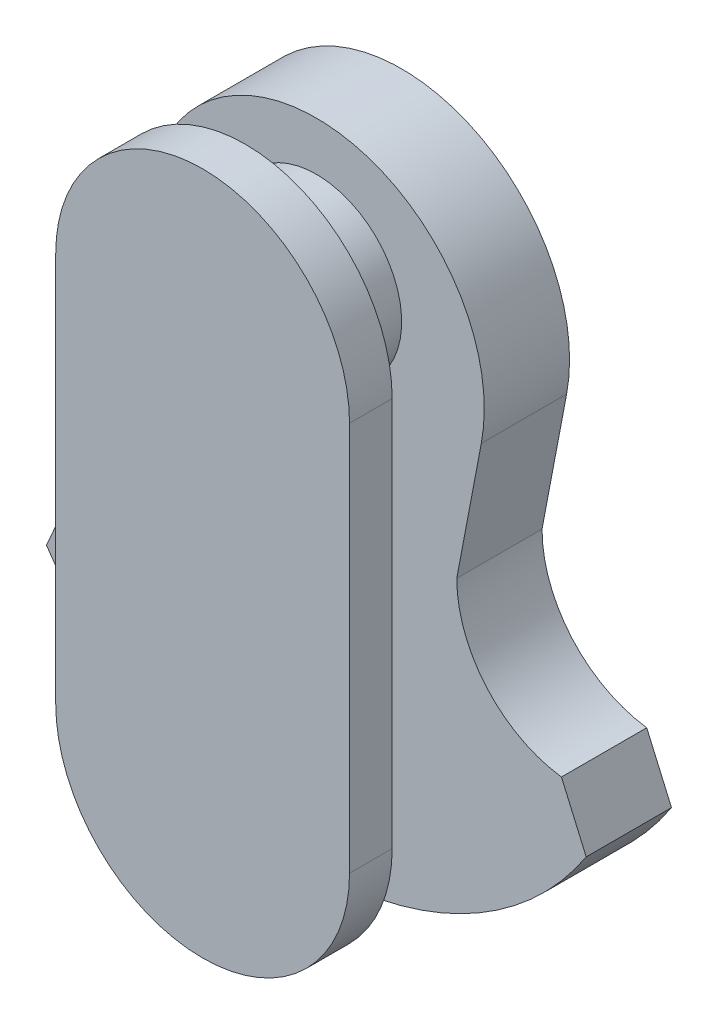
ISO-10303-21;
HEADER;
FILE_DESCRIPTION(('STEP AP214'),'2;1');
FILE_NAME('part.step','',(''),(''),'','','');
FILE_SCHEMA(('AUTOMOTIVE_DESIGN { 1 0 10303 214 1 1 1 1 }'));
ENDSEC;
DATA;
#1=APPLICATION_CONTEXT('core data for automotive mechanical design processes');
#2=APPLICATION_PROTOCOL_DEFINITION('international standard','automotive_design',2000,#1);
#3=PRODUCT_CONTEXT('',#1,'mechanical');
#4=PRODUCT('Part','Part','',(#3));
#5=PRODUCT_RELATED_PRODUCT_CATEGORY('part','',(#4));
#6=PRODUCT_DEFINITION_FORMATION('','',#4);
#7=PRODUCT_DEFINITION_CONTEXT('part definition',#1,'design');
#8=PRODUCT_DEFINITION('design','',#6,#7);
#9=PRODUCT_DEFINITION_SHAPE('','',#8);
#10=(LENGTH_UNIT() NAMED_UNIT(*) SI_UNIT(.MILLI.,.METRE.));
#11=(NAMED_UNIT(*) PLANE_ANGLE_UNIT() SI_UNIT($,.RADIAN.));
#12=(NAMED_UNIT(*) SI_UNIT($,.STERADIAN.) SOLID_ANGLE_UNIT());
#13=UNCERTAINTY_MEASURE_WITH_UNIT(LENGTH_MEASURE(1.E-05),#10,'distance_accuracy_value','');
#14=(GEOMETRIC_REPRESENTATION_CONTEXT(3) GLOBAL_UNCERTAINTY_ASSIGNED_CONTEXT((#13)) GLOBAL_UNIT_ASSIGNED_CONTEXT((#10,
#11,#12)) REPRESENTATION_CONTEXT('',''));
#15=CARTESIAN_POINT('',(0.,0.,0.));
#16=DIRECTION('',(0.,0.,1.));
#17=DIRECTION('',(1.,0.,0.));
#18=AXIS2_PLACEMENT_3D('',#15,#16,#17);
#19=CARTESIAN_POINT('',(570.695429584603,237.392875312342,42.));
#20=DIRECTION('',(0.,0.,-1.));
#21=DIRECTION('',(-1.,0.,0.));
#22=AXIS2_PLACEMENT_3D('',#19,#20,#21);
#23=CYLINDRICAL_SURFACE('',#22,31.);
#24=CARTESIAN_POINT('',(570.695429584603,237.392875312342,33.));
#25=DIRECTION('',(0.,0.,1.));
#26=DIRECTION('',(-1.,0.,0.));
#27=AXIS2_PLACEMENT_3D('',#24,#25,#26);
#28=CIRCLE('',#27,31.);
#29=CARTESIAN_POINT('',(601.695429584603,237.392875312342,33.));
#30=VERTEX_POINT('',#29);
#31=CARTESIAN_POINT('',(539.695429584603,237.392875312342,33.));
#32=VERTEX_POINT('',#31);
#33=EDGE_CURVE('E211',#30,#32,#28,.T.);
#34=ORIENTED_EDGE('',*,*,#33,.T.);
#35=DIRECTION('',(0.,0.,-1.));
#36=VECTOR('',#35,1.);
#37=CARTESIAN_POINT('',(539.695429584603,237.392875312342,42.));
#38=LINE('',#37,#36);
#39=CARTESIAN_POINT('',(539.695429584603,237.392875312342,42.));
#40=VERTEX_POINT('',#39);
#41=EDGE_CURVE('E11',#40,#32,#38,.T.);
#42=ORIENTED_EDGE('',*,*,#41,.F.);
#43=CARTESIAN_POINT('',(570.695429584603,237.392875312342,42.));
#44=DIRECTION('',(0.,0.,1.));
#45=DIRECTION('',(-1.,0.,0.));
#46=AXIS2_PLACEMENT_3D('',#43,#44,#45);
#47=CIRCLE('',#46,31.);
#48=CARTESIAN_POINT('',(601.695429584603,237.392875312342,42.));
#49=VERTEX_POINT('',#48);
#50=EDGE_CURVE('E212',#49,#40,#47,.T.);
#51=ORIENTED_EDGE('',*,*,#50,.F.);
#52=DIRECTION('',(0.,0.,-1.));
#53=VECTOR('',#52,1.);
#54=CARTESIAN_POINT('',(601.695429584603,237.392875312342,42.));
#55=LINE('',#54,#53);
#56=EDGE_CURVE('E218',#49,#30,#55,.T.);
#57=ORIENTED_EDGE('',*,*,#56,.T.);
#58=EDGE_LOOP('',(#34,#42,#51,#57));
#59=FACE_BOUND('',#58,.T.);
#60=ADVANCED_FACE('F37',(#59),#23,.T.);
#61=CARTESIAN_POINT('',(539.695429584603,155.146756510014,42.));
#62=DIRECTION('',(1.,0.,0.));
#63=DIRECTION('',(0.,0.,-1.));
#64=AXIS2_PLACEMENT_3D('',#61,#62,#63);
#65=PLANE('',#64);
#66=DIRECTION('',(0.,-1.,0.));
#67=VECTOR('',#66,1.);
#68=CARTESIAN_POINT('',(539.695429584603,155.146756510014,33.));
#69=LINE('',#68,#67);
#70=CARTESIAN_POINT('',(539.695429584603,155.146756510014,33.));
#71=VERTEX_POINT('',#70);
#72=EDGE_CURVE('E221',#32,#71,#69,.T.);
#73=ORIENTED_EDGE('',*,*,#72,.T.);
#74=DIRECTION('',(0.,0.,-1.));
#75=VECTOR('',#74,1.);
#76=CARTESIAN_POINT('',(539.695429584603,155.146756510014,42.));
#77=LINE('',#76,#75);
#78=CARTESIAN_POINT('',(539.695429584603,155.146756510014,42.));
#79=VERTEX_POINT('',#78);
#80=EDGE_CURVE('E45',#79,#71,#77,.T.);
#81=ORIENTED_EDGE('',*,*,#80,.F.);
#82=DIRECTION('',(0.,-1.,0.));
#83=VECTOR('',#82,1.);
#84=CARTESIAN_POINT('',(539.695429584603,155.146756510014,42.));
#85=LINE('',#84,#83);
#86=EDGE_CURVE('E84',#40,#79,#85,.T.);
#87=ORIENTED_EDGE('',*,*,#86,.F.);
#88=ORIENTED_EDGE('',*,*,#41,.T.);
#89=EDGE_LOOP('',(#73,#81,#87,#88));
#90=FACE_BOUND('',#89,.T.);
#91=ADVANCED_FACE('F244',(#90),#65,.F.);
#92=CARTESIAN_POINT('',(570.695429584603,155.146756510014,42.));
#93=DIRECTION('',(0.,0.,-1.));
#94=DIRECTION('',(-1.,0.,0.));
#95=AXIS2_PLACEMENT_3D('',#92,#93,#94);
#96=CYLINDRICAL_SURFACE('',#95,31.);
#97=CARTESIAN_POINT('',(570.695429584603,155.146756510014,33.));
#98=DIRECTION('',(0.,0.,1.));
#99=DIRECTION('',(1.,0.,0.));
#100=AXIS2_PLACEMENT_3D('',#97,#98,#99);
#101=CIRCLE('',#100,31.);
#102=CARTESIAN_POINT('',(601.695429584603,155.146756510014,33.));
#103=VERTEX_POINT('',#102);
#104=EDGE_CURVE('E71',#71,#103,#101,.T.);
#105=ORIENTED_EDGE('',*,*,#104,.T.);
#106=DIRECTION('',(0.,0.,-1.));
#107=VECTOR('',#106,1.);
#108=CARTESIAN_POINT('',(601.695429584603,155.146756510014,42.));
#109=LINE('',#108,#107);
#110=CARTESIAN_POINT('',(601.695429584603,155.146756510014,42.));
#111=VERTEX_POINT('',#110);
#112=EDGE_CURVE('E226',#111,#103,#109,.T.);
#113=ORIENTED_EDGE('',*,*,#112,.F.);
#114=CARTESIAN_POINT('',(570.695429584603,155.146756510014,42.));
#115=DIRECTION('',(0.,0.,1.));
#116=DIRECTION('',(1.,0.,0.));
#117=AXIS2_PLACEMENT_3D('',#114,#115,#116);
#118=CIRCLE('',#117,31.);
#119=EDGE_CURVE('E215',#79,#111,#118,.T.);
#120=ORIENTED_EDGE('',*,*,#119,.F.);
#121=ORIENTED_EDGE('',*,*,#80,.T.);
#122=EDGE_LOOP('',(#105,#113,#120,#121));
#123=FACE_BOUND('',#122,.T.);
#124=ADVANCED_FACE('F228',(#123),#96,.T.);
#125=CARTESIAN_POINT('',(601.695429584603,155.146756510014,42.));
#126=DIRECTION('',(-1.,0.,0.));
#127=DIRECTION('',(0.,0.,1.));
#128=AXIS2_PLACEMENT_3D('',#125,#126,#127);
#129=PLANE('',#128);
#130=DIRECTION('',(0.,1.,0.));
#131=VECTOR('',#130,1.);
#132=CARTESIAN_POINT('',(601.695429584603,155.146756510014,33.));
#133=LINE('',#132,#131);
#134=EDGE_CURVE('E77',#103,#30,#133,.T.);
#135=ORIENTED_EDGE('',*,*,#134,.T.);
#136=ORIENTED_EDGE('',*,*,#56,.F.);
#137=DIRECTION('',(0.,1.,0.));
#138=VECTOR('',#137,1.);
#139=CARTESIAN_POINT('',(601.695429584603,155.146756510014,42.));
#140=LINE('',#139,#138);
#141=EDGE_CURVE('E53',#111,#49,#140,.T.);
#142=ORIENTED_EDGE('',*,*,#141,.F.);
#143=ORIENTED_EDGE('',*,*,#112,.T.);
#144=EDGE_LOOP('',(#135,#136,#142,#143));
#145=FACE_BOUND('',#144,.T.);
#146=ADVANCED_FACE('F235',(#145),#129,.F.);
#147=CARTESIAN_POINT('',(570.695429584603,237.392875312342,42.));
#148=DIRECTION('',(0.,0.,-1.));
#149=DIRECTION('',(-1.,0.,0.));
#150=AXIS2_PLACEMENT_3D('',#147,#148,#149);
#151=PLANE('',#150);
#152=ORIENTED_EDGE('',*,*,#50,.T.);
#153=ORIENTED_EDGE('',*,*,#86,.T.);
#154=ORIENTED_EDGE('',*,*,#119,.T.);
#155=ORIENTED_EDGE('',*,*,#141,.T.);
#156=EDGE_LOOP('',(#152,#153,#154,#155));
#157=FACE_BOUND('',#156,.T.);
#158=ADVANCED_FACE('F237',(#157),#151,.F.);
#159=CARTESIAN_POINT('',(570.695429584603,237.392875312342,33.));
#160=DIRECTION('',(0.,0.,-1.));
#161=DIRECTION('',(-1.,0.,0.));
#162=AXIS2_PLACEMENT_3D('',#159,#160,#161);
#163=PLANE('',#162);
#164=CARTESIAN_POINT('',(570.695429584603,237.392875312342,33.));
#165=DIRECTION('',(0.,0.,1.));
#166=DIRECTION('',(1.,0.,0.));
#167=AXIS2_PLACEMENT_3D('',#164,#165,#166);
#168=CIRCLE('',#167,18.);
#169=CARTESIAN_POINT('',(588.695429584603,237.392875312342,33.));
#170=VERTEX_POINT('',#169);
#171=EDGE_CURVE('E165',#170,#170,#168,.T.);
#172=ORIENTED_EDGE('',*,*,#171,.T.);
#173=EDGE_LOOP('',(#172));
#174=FACE_BOUND('',#173,.T.);
#175=ORIENTED_EDGE('',*,*,#33,.F.);
#176=ORIENTED_EDGE('',*,*,#134,.F.);
#177=ORIENTED_EDGE('',*,*,#104,.F.);
#178=ORIENTED_EDGE('',*,*,#72,.F.);
#179=EDGE_LOOP('',(#175,#176,#177,#178));
#180=FACE_BOUND('',#179,.T.);
#181=ADVANCED_FACE('F231',(#174,#180),#163,.T.);
#182=CARTESIAN_POINT('',(570.695429584603,230.233917143248,18.));
#183=DIRECTION('',(0.,0.,-1.));
#184=DIRECTION('',(-1.,0.,0.));
#185=AXIS2_PLACEMENT_3D('',#182,#183,#184);
#186=CYLINDRICAL_SURFACE('',#185,35.4334161218581);
#187=CARTESIAN_POINT('',(570.695429584603,230.233917143248,0.));
#188=DIRECTION('',(0.,0.,-1.));
#189=DIRECTION('',(-1.,0.,0.));
#190=AXIS2_PLACEMENT_3D('',#187,#188,#189);
#191=CIRCLE('',#190,35.4334161218581);
#192=CARTESIAN_POINT('',(535.885484235185,223.616162022724,0.));
#193=VERTEX_POINT('',#192);
#194=CARTESIAN_POINT('',(605.505374934022,223.616162022724,0.));
#195=VERTEX_POINT('',#194);
#196=EDGE_CURVE('E179',#193,#195,#191,.T.);
#197=ORIENTED_EDGE('',*,*,#196,.F.);
#198=DIRECTION('',(0.,0.,-1.));
#199=VECTOR('',#198,1.);
#200=CARTESIAN_POINT('',(535.885484235185,223.616162022724,18.));
#201=LINE('',#200,#199);
#202=CARTESIAN_POINT('',(535.885484235185,223.616162022724,18.));
#203=VERTEX_POINT('',#202);
#204=EDGE_CURVE('E157',#203,#193,#201,.T.);
#205=ORIENTED_EDGE('',*,*,#204,.F.);
#206=CARTESIAN_POINT('',(570.695429584603,230.233917143248,18.));
#207=DIRECTION('',(0.,0.,-1.));
#208=DIRECTION('',(-1.,0.,0.));
#209=AXIS2_PLACEMENT_3D('',#206,#207,#208);
#210=CIRCLE('',#209,35.4334161218581);
#211=CARTESIAN_POINT('',(605.505374934022,223.616162022724,18.));
#212=VERTEX_POINT('',#211);
#213=EDGE_CURVE('E151',#203,#212,#210,.T.);
#214=ORIENTED_EDGE('',*,*,#213,.T.);
#215=DIRECTION('',(0.,0.,-1.));
#216=VECTOR('',#215,1.);
#217=CARTESIAN_POINT('',(605.505374934022,223.616162022724,18.));
#218=LINE('',#217,#216);
#219=EDGE_CURVE('E135',#212,#195,#218,.T.);
#220=ORIENTED_EDGE('',*,*,#219,.T.);
#221=EDGE_LOOP('',(#197,#205,#214,#220));
#222=FACE_BOUND('',#221,.T.);
#223=ADVANCED_FACE('F156',(#222),#186,.T.);
#224=CARTESIAN_POINT('',(535.885484235185,223.616162022724,18.));
#225=DIRECTION('',(0.982404440760239,0.186765935798157,0.));
#226=DIRECTION('',(-0.186765935798157,0.982404440760239,0.));
#227=AXIS2_PLACEMENT_3D('',#224,#225,#226);
#228=PLANE('',#227);
#229=DIRECTION('',(0.186765935798157,-0.982404440760239,0.));
#230=VECTOR('',#229,1.);
#231=CARTESIAN_POINT('',(535.885484235185,223.616162022724,0.));
#232=LINE('',#231,#230);
#233=CARTESIAN_POINT('',(541.069644924943,196.347043264703,0.));
#234=VERTEX_POINT('',#233);
#235=EDGE_CURVE('E159',#193,#234,#232,.T.);
#236=ORIENTED_EDGE('',*,*,#235,.T.);
#237=DIRECTION('',(0.,0.,-1.));
#238=VECTOR('',#237,1.);
#239=CARTESIAN_POINT('',(541.069644924943,196.347043264703,18.));
#240=LINE('',#239,#238);
#241=CARTESIAN_POINT('',(541.069644924943,196.347043264703,18.));
#242=VERTEX_POINT('',#241);
#243=EDGE_CURVE('E196',#242,#234,#240,.T.);
#244=ORIENTED_EDGE('',*,*,#243,.F.);
#245=DIRECTION('',(0.186765935798157,-0.982404440760239,0.));
#246=VECTOR('',#245,1.);
#247=CARTESIAN_POINT('',(535.885484235185,223.616162022724,18.));
#248=LINE('',#247,#246);
#249=EDGE_CURVE('E146',#203,#242,#248,.T.);
#250=ORIENTED_EDGE('',*,*,#249,.F.);
#251=ORIENTED_EDGE('',*,*,#204,.T.);
#252=EDGE_LOOP('',(#236,#244,#250,#251));
#253=FACE_BOUND('',#252,.T.);
#254=ADVANCED_FACE('F286',(#253),#228,.F.);
#255=CARTESIAN_POINT('',(515.589616858607,196.347043264703,18.));
#256=DIRECTION('',(0.,0.,-1.));
#257=DIRECTION('',(-1.,0.,0.));
#258=AXIS2_PLACEMENT_3D('',#255,#256,#257);
#259=CYLINDRICAL_SURFACE('',#258,25.480028066336);
#260=CARTESIAN_POINT('',(515.589616858607,196.347043264703,0.));
#261=DIRECTION('',(0.,0.,1.));
#262=DIRECTION('',(1.,0.,0.));
#263=AXIS2_PLACEMENT_3D('',#260,#261,#262);
#264=CIRCLE('',#263,25.480028066336);
#265=CARTESIAN_POINT('',(518.975806011665,171.093022727747,0.));
#266=VERTEX_POINT('',#265);
#267=EDGE_CURVE('E162',#266,#234,#264,.T.);
#268=ORIENTED_EDGE('',*,*,#267,.F.);
#269=DIRECTION('',(0.,0.,-1.));
#270=VECTOR('',#269,1.);
#271=CARTESIAN_POINT('',(518.975806011665,171.093022727747,18.));
#272=LINE('',#271,#270);
#273=CARTESIAN_POINT('',(518.975806011665,171.093022727747,18.));
#274=VERTEX_POINT('',#273);
#275=EDGE_CURVE('E198',#274,#266,#272,.T.);
#276=ORIENTED_EDGE('',*,*,#275,.F.);
#277=CARTESIAN_POINT('',(515.589616858607,196.347043264703,18.));
#278=DIRECTION('',(0.,0.,1.));
#279=DIRECTION('',(1.,0.,0.));
#280=AXIS2_PLACEMENT_3D('',#277,#278,#279);
#281=CIRCLE('',#280,25.480028066336);
#282=EDGE_CURVE('E175',#274,#242,#281,.T.);
#283=ORIENTED_EDGE('',*,*,#282,.T.);
#284=ORIENTED_EDGE('',*,*,#243,.T.);
#285=EDGE_LOOP('',(#268,#276,#283,#284));
#286=FACE_BOUND('',#285,.T.);
#287=ADVANCED_FACE('F295',(#286),#259,.F.);
#288=CARTESIAN_POINT('',(513.746536265262,159.110381716047,18.));
#289=DIRECTION('',(-0.916525893341748,0.399975357783589,0.));
#290=DIRECTION('',(-0.399975357783589,-0.916525893341749,0.));
#291=AXIS2_PLACEMENT_3D('',#288,#289,#290);
#292=PLANE('',#291);
#293=DIRECTION('',(0.399975357783589,0.916525893341748,0.));
#294=VECTOR('',#293,1.);
#295=CARTESIAN_POINT('',(513.746536265262,159.110381716047,0.));
#296=LINE('',#295,#294);
#297=CARTESIAN_POINT('',(513.746536265262,159.110381716047,0.));
#298=VERTEX_POINT('',#297);
#299=EDGE_CURVE('E189',#298,#266,#296,.T.);
#300=ORIENTED_EDGE('',*,*,#299,.F.);
#301=DIRECTION('',(0.,0.,-1.));
#302=VECTOR('',#301,1.);
#303=CARTESIAN_POINT('',(513.746536265262,159.110381716047,18.));
#304=LINE('',#303,#302);
#305=CARTESIAN_POINT('',(513.746536265262,159.110381716047,18.));
#306=VERTEX_POINT('',#305);
#307=EDGE_CURVE('E200',#306,#298,#304,.T.);
#308=ORIENTED_EDGE('',*,*,#307,.F.);
#309=DIRECTION('',(0.399975357783589,0.916525893341748,0.));
#310=VECTOR('',#309,1.);
#311=CARTESIAN_POINT('',(513.746536265262,159.110381716047,18.));
#312=LINE('',#311,#310);
#313=EDGE_CURVE('E172',#306,#274,#312,.T.);
#314=ORIENTED_EDGE('',*,*,#313,.T.);
#315=ORIENTED_EDGE('',*,*,#275,.T.);
#316=EDGE_LOOP('',(#300,#308,#314,#315));
#317=FACE_BOUND('',#316,.T.);
#318=ADVANCED_FACE('F305',(#317),#292,.T.);
#319=CARTESIAN_POINT('',(570.695429584603,196.269815911178,18.));
#320=DIRECTION('',(0.,0.,-1.));
#321=DIRECTION('',(-1.,0.,0.));
#322=AXIS2_PLACEMENT_3D('',#319,#320,#321);
#323=CYLINDRICAL_SURFACE('',#322,67.9999999999999);
#324=CARTESIAN_POINT('',(570.695429584603,196.269815911178,0.));
#325=DIRECTION('',(0.,0.,1.));
#326=DIRECTION('',(1.,0.,0.));
#327=AXIS2_PLACEMENT_3D('',#324,#325,#326);
#328=CIRCLE('',#327,67.9999999999999);
#329=CARTESIAN_POINT('',(627.644322903945,159.110381716047,0.));
#330=VERTEX_POINT('',#329);
#331=EDGE_CURVE('E187',#298,#330,#328,.T.);
#332=ORIENTED_EDGE('',*,*,#331,.T.);
#333=DIRECTION('',(0.,0.,-1.));
#334=VECTOR('',#333,1.);
#335=CARTESIAN_POINT('',(627.644322903945,159.110381716047,18.));
#336=LINE('',#335,#334);
#337=CARTESIAN_POINT('',(627.644322903945,159.110381716047,18.));
#338=VERTEX_POINT('',#337);
#339=EDGE_CURVE('E202',#338,#330,#336,.T.);
#340=ORIENTED_EDGE('',*,*,#339,.F.);
#341=CARTESIAN_POINT('',(570.695429584603,196.269815911178,18.));
#342=DIRECTION('',(0.,0.,1.));
#343=DIRECTION('',(1.,0.,0.));
#344=AXIS2_PLACEMENT_3D('',#341,#342,#343);
#345=CIRCLE('',#344,67.9999999999999);
#346=EDGE_CURVE('E170',#306,#338,#345,.T.);
#347=ORIENTED_EDGE('',*,*,#346,.F.);
#348=ORIENTED_EDGE('',*,*,#307,.T.);
#349=EDGE_LOOP('',(#332,#340,#347,#348));
#350=FACE_BOUND('',#349,.T.);
#351=ADVANCED_FACE('F315',(#350),#323,.T.);
#352=CARTESIAN_POINT('',(627.644322903945,159.110381716047,18.));
#353=DIRECTION('',(-0.916525893341748,-0.39997535778359,0.));
#354=DIRECTION('',(0.39997535778359,-0.916525893341748,0.));
#355=AXIS2_PLACEMENT_3D('',#352,#353,#354);
#356=PLANE('',#355);
#357=DIRECTION('',(-0.39997535778359,0.916525893341748,0.));
#358=VECTOR('',#357,1.);
#359=CARTESIAN_POINT('',(627.644322903945,159.110381716047,0.));
#360=LINE('',#359,#358);
#361=CARTESIAN_POINT('',(622.415053157542,171.093022727747,0.));
#362=VERTEX_POINT('',#361);
#363=EDGE_CURVE('E185',#330,#362,#360,.T.);
#364=ORIENTED_EDGE('',*,*,#363,.T.);
#365=DIRECTION('',(0.,0.,-1.));
#366=VECTOR('',#365,1.);
#367=CARTESIAN_POINT('',(622.415053157542,171.093022727747,18.));
#368=LINE('',#367,#366);
#369=CARTESIAN_POINT('',(622.415053157542,171.093022727747,18.));
#370=VERTEX_POINT('',#369);
#371=EDGE_CURVE('E205',#370,#362,#368,.T.);
#372=ORIENTED_EDGE('',*,*,#371,.F.);
#373=DIRECTION('',(-0.39997535778359,0.916525893341748,0.));
#374=VECTOR('',#373,1.);
#375=CARTESIAN_POINT('',(627.644322903945,159.110381716047,18.));
#376=LINE('',#375,#374);
#377=EDGE_CURVE('E168',#338,#370,#376,.T.);
#378=ORIENTED_EDGE('',*,*,#377,.F.);
#379=ORIENTED_EDGE('',*,*,#339,.T.);
#380=EDGE_LOOP('',(#364,#372,#378,#379));
#381=FACE_BOUND('',#380,.T.);
#382=ADVANCED_FACE('F325',(#381),#356,.F.);
#383=CARTESIAN_POINT('',(625.8012423106,196.347043264703,18.));
#384=DIRECTION('',(0.,0.,-1.));
#385=DIRECTION('',(-1.,0.,0.));
#386=AXIS2_PLACEMENT_3D('',#383,#384,#385);
#387=CYLINDRICAL_SURFACE('',#386,25.480028066336);
#388=CARTESIAN_POINT('',(625.8012423106,196.347043264703,0.));
#389=DIRECTION('',(0.,0.,-1.));
#390=DIRECTION('',(-1.,0.,0.));
#391=AXIS2_PLACEMENT_3D('',#388,#389,#390);
#392=CIRCLE('',#391,25.480028066336);
#393=CARTESIAN_POINT('',(600.321214244264,196.347043264703,0.));
#394=VERTEX_POINT('',#393);
#395=EDGE_CURVE('E182',#362,#394,#392,.T.);
#396=ORIENTED_EDGE('',*,*,#395,.T.);
#397=DIRECTION('',(0.,0.,-1.));
#398=VECTOR('',#397,1.);
#399=CARTESIAN_POINT('',(600.321214244264,196.347043264703,18.));
#400=LINE('',#399,#398);
#401=CARTESIAN_POINT('',(600.321214244264,196.347043264703,18.));
#402=VERTEX_POINT('',#401);
#403=EDGE_CURVE('E145',#402,#394,#400,.T.);
#404=ORIENTED_EDGE('',*,*,#403,.F.);
#405=CARTESIAN_POINT('',(625.8012423106,196.347043264703,18.));
#406=DIRECTION('',(0.,0.,-1.));
#407=DIRECTION('',(-1.,0.,0.));
#408=AXIS2_PLACEMENT_3D('',#405,#406,#407);
#409=CIRCLE('',#408,25.480028066336);
#410=EDGE_CURVE('E153',#370,#402,#409,.T.);
#411=ORIENTED_EDGE('',*,*,#410,.F.);
#412=ORIENTED_EDGE('',*,*,#371,.T.);
#413=EDGE_LOOP('',(#396,#404,#411,#412));
#414=FACE_BOUND('',#413,.T.);
#415=ADVANCED_FACE('F335',(#414),#387,.F.);
#416=CARTESIAN_POINT('',(605.505374934022,223.616162022724,18.));
#417=DIRECTION('',(0.982404440760239,-0.186765935798157,0.));
#418=DIRECTION('',(0.186765935798157,0.982404440760239,0.));
#419=AXIS2_PLACEMENT_3D('',#416,#417,#418);
#420=PLANE('',#419);
#421=DIRECTION('',(-0.186765935798157,-0.982404440760239,0.));
#422=VECTOR('',#421,1.);
#423=CARTESIAN_POINT('',(605.505374934022,223.616162022724,0.));
#424=LINE('',#423,#422);
#425=EDGE_CURVE('E140',#195,#394,#424,.T.);
#426=ORIENTED_EDGE('',*,*,#425,.F.);
#427=ORIENTED_EDGE('',*,*,#219,.F.);
#428=DIRECTION('',(-0.186765935798157,-0.982404440760239,0.));
#429=VECTOR('',#428,1.);
#430=CARTESIAN_POINT('',(605.505374934022,223.616162022724,18.));
#431=LINE('',#430,#429);
#432=EDGE_CURVE('E138',#212,#402,#431,.T.);
#433=ORIENTED_EDGE('',*,*,#432,.T.);
#434=ORIENTED_EDGE('',*,*,#403,.T.);
#435=EDGE_LOOP('',(#426,#427,#433,#434));
#436=FACE_BOUND('',#435,.T.);
#437=ADVANCED_FACE('F137',(#436),#420,.T.);
#438=CARTESIAN_POINT('',(570.695429584603,230.233917143248,18.));
#439=DIRECTION('',(0.,0.,-1.));
#440=DIRECTION('',(-1.,0.,0.));
#441=AXIS2_PLACEMENT_3D('',#438,#439,#440);
#442=PLANE('',#441);
#443=CARTESIAN_POINT('',(570.695429584603,237.392875312342,18.));
#444=DIRECTION('',(0.,0.,-1.));
#445=DIRECTION('',(-1.,0.,0.));
#446=AXIS2_PLACEMENT_3D('',#443,#444,#445);
#447=CIRCLE('',#446,18.);
#448=CARTESIAN_POINT('',(552.695429584603,237.392875312342,18.));
#449=VERTEX_POINT('',#448);
#450=EDGE_CURVE('E195',#449,#449,#447,.F.);
#451=ORIENTED_EDGE('',*,*,#450,.F.);
#452=EDGE_LOOP('',(#451));
#453=FACE_BOUND('',#452,.T.);
#454=ORIENTED_EDGE('',*,*,#213,.F.);
#455=ORIENTED_EDGE('',*,*,#249,.T.);
#456=ORIENTED_EDGE('',*,*,#282,.F.);
#457=ORIENTED_EDGE('',*,*,#313,.F.);
#458=ORIENTED_EDGE('',*,*,#346,.T.);
#459=ORIENTED_EDGE('',*,*,#377,.T.);
#460=ORIENTED_EDGE('',*,*,#410,.T.);
#461=ORIENTED_EDGE('',*,*,#432,.F.);
#462=EDGE_LOOP('',(#454,#455,#456,#457,#458,#459,#460,#461));
#463=FACE_BOUND('',#462,.T.);
#464=ADVANCED_FACE('F150',(#453,#463),#442,.F.);
#465=CARTESIAN_POINT('',(570.695429584603,230.233917143248,0.));
#466=DIRECTION('',(0.,0.,-1.));
#467=DIRECTION('',(-1.,0.,0.));
#468=AXIS2_PLACEMENT_3D('',#465,#466,#467);
#469=PLANE('',#468);
#470=ORIENTED_EDGE('',*,*,#196,.T.);
#471=ORIENTED_EDGE('',*,*,#425,.T.);
#472=ORIENTED_EDGE('',*,*,#395,.F.);
#473=ORIENTED_EDGE('',*,*,#363,.F.);
#474=ORIENTED_EDGE('',*,*,#331,.F.);
#475=ORIENTED_EDGE('',*,*,#299,.T.);
#476=ORIENTED_EDGE('',*,*,#267,.T.);
#477=ORIENTED_EDGE('',*,*,#235,.F.);
#478=EDGE_LOOP('',(#470,#471,#472,#473,#474,#475,#476,#477));
#479=FACE_BOUND('',#478,.T.);
#480=ADVANCED_FACE('F362',(#479),#469,.T.);
#481=CARTESIAN_POINT('',(570.695429584603,237.392875312342,33.));
#482=DIRECTION('',(0.,0.,-1.));
#483=DIRECTION('',(-1.,0.,0.));
#484=AXIS2_PLACEMENT_3D('',#481,#482,#483);
#485=CYLINDRICAL_SURFACE('',#484,18.);
#486=ORIENTED_EDGE('',*,*,#171,.F.);
#487=EDGE_LOOP('',(#486));
#488=FACE_BOUND('',#487,.T.);
#489=ORIENTED_EDGE('',*,*,#450,.T.);
#490=EDGE_LOOP('',(#489));
#491=FACE_BOUND('',#490,.T.);
#492=ADVANCED_FACE('F372',(#488,#491),#485,.T.);
#493=CLOSED_SHELL('',(#60,#91,#124,#146,#158,#181,#223,#254,#287,#318,#351,#382,#415,#437,#464,
#480,#492));
#494=MANIFOLD_SOLID_BREP('B2',#493);
#495=ADVANCED_BREP_SHAPE_REPRESENTATION('',(#18,#494),#14);
#496=SHAPE_DEFINITION_REPRESENTATION(#9,#495);
ENDSEC;
END-ISO-10303-21;
